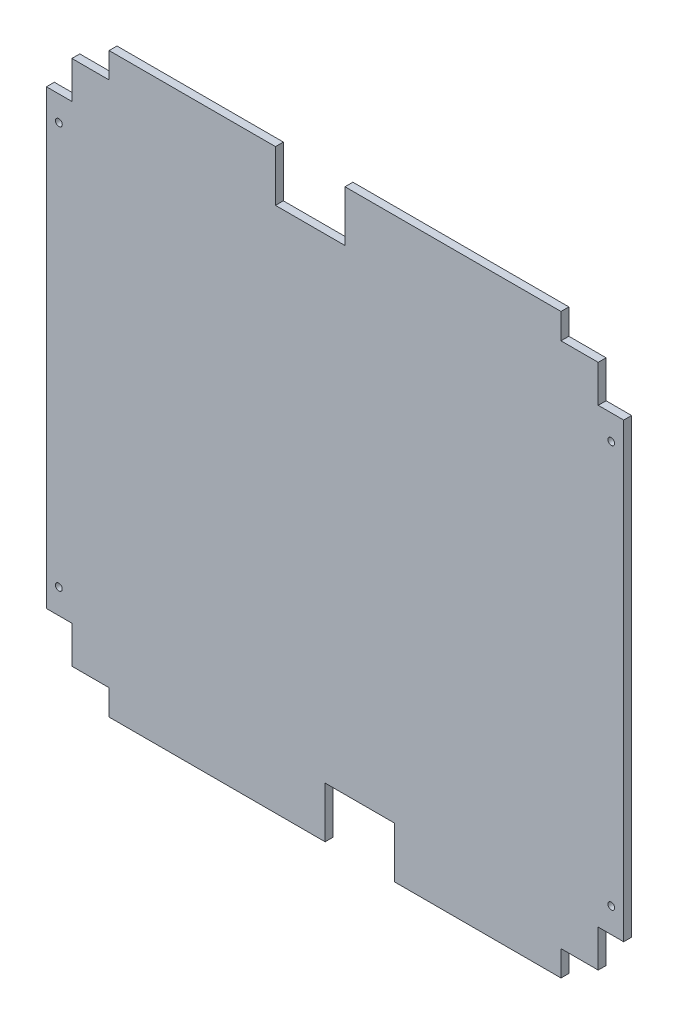
ISO-10303-21;
HEADER;
FILE_DESCRIPTION(('STEP AP214'),'2;1');
FILE_NAME('part.step','',(''),(''),'','','');
FILE_SCHEMA(('AUTOMOTIVE_DESIGN { 1 0 10303 214 1 1 1 1 }'));
ENDSEC;
DATA;
#1=APPLICATION_CONTEXT('core data for automotive mechanical design processes');
#2=APPLICATION_PROTOCOL_DEFINITION('international standard','automotive_design',2000,#1);
#3=PRODUCT_CONTEXT('',#1,'mechanical');
#4=PRODUCT('Part','Part','',(#3));
#5=PRODUCT_RELATED_PRODUCT_CATEGORY('part','',(#4));
#6=PRODUCT_DEFINITION_FORMATION('','',#4);
#7=PRODUCT_DEFINITION_CONTEXT('part definition',#1,'design');
#8=PRODUCT_DEFINITION('design','',#6,#7);
#9=PRODUCT_DEFINITION_SHAPE('','',#8);
#10=(LENGTH_UNIT() NAMED_UNIT(*) SI_UNIT(.MILLI.,.METRE.));
#11=(NAMED_UNIT(*) PLANE_ANGLE_UNIT() SI_UNIT($,.RADIAN.));
#12=(NAMED_UNIT(*) SI_UNIT($,.STERADIAN.) SOLID_ANGLE_UNIT());
#13=UNCERTAINTY_MEASURE_WITH_UNIT(LENGTH_MEASURE(1.E-05),#10,'distance_accuracy_value','');
#14=(GEOMETRIC_REPRESENTATION_CONTEXT(3) GLOBAL_UNCERTAINTY_ASSIGNED_CONTEXT((#13)) GLOBAL_UNIT_ASSIGNED_CONTEXT((#10,
#11,#12)) REPRESENTATION_CONTEXT('',''));
#15=CARTESIAN_POINT('',(0.,0.,0.));
#16=DIRECTION('',(0.,0.,1.));
#17=DIRECTION('',(1.,0.,0.));
#18=AXIS2_PLACEMENT_3D('',#15,#16,#17);
#19=CARTESIAN_POINT('',(0.,0.,6.35));
#20=DIRECTION('',(0.,0.,1.));
#21=DIRECTION('',(1.,0.,0.));
#22=AXIS2_PLACEMENT_3D('',#19,#20,#21);
#23=PLANE('',#22);
#24=CARTESIAN_POINT('',(222.499999999999,162.000000000001,6.35));
#25=DIRECTION('',(0.,0.,1.));
#26=DIRECTION('',(1.,0.,0.));
#27=AXIS2_PLACEMENT_3D('',#24,#25,#26);
#28=CIRCLE('',#27,2.75000000000001);
#29=CARTESIAN_POINT('',(225.249999999999,162.000000000001,6.35));
#30=VERTEX_POINT('',#29);
#31=EDGE_CURVE('E797',#30,#30,#28,.T.);
#32=ORIENTED_EDGE('',*,*,#31,.F.);
#33=EDGE_LOOP('',(#32));
#34=FACE_BOUND('',#33,.T.);
#35=CARTESIAN_POINT('',(-222.5,-162.,6.35));
#36=DIRECTION('',(0.,0.,1.));
#37=DIRECTION('',(1.,0.,0.));
#38=AXIS2_PLACEMENT_3D('',#35,#36,#37);
#39=CIRCLE('',#38,2.75000000000001);
#40=CARTESIAN_POINT('',(-219.75,-162.,6.35));
#41=VERTEX_POINT('',#40);
#42=EDGE_CURVE('E252',#41,#41,#39,.T.);
#43=ORIENTED_EDGE('',*,*,#42,.F.);
#44=EDGE_LOOP('',(#43));
#45=FACE_BOUND('',#44,.T.);
#46=DIRECTION('',(0.,-1.,0.));
#47=VECTOR('',#46,1.);
#48=CARTESIAN_POINT('',(-232.499999999999,182.000000000002,6.35));
#49=LINE('',#48,#47);
#50=CARTESIAN_POINT('',(-232.499999999999,182.000000000002,6.35));
#51=VERTEX_POINT('',#50);
#52=CARTESIAN_POINT('',(-232.5,-182.,6.35));
#53=VERTEX_POINT('',#52);
#54=EDGE_CURVE('E152',#51,#53,#49,.T.);
#55=ORIENTED_EDGE('',*,*,#54,.T.);
#56=DIRECTION('',(1.,0.,0.));
#57=VECTOR('',#56,1.);
#58=CARTESIAN_POINT('',(-232.5,-182.,6.35));
#59=LINE('',#58,#57);
#60=CARTESIAN_POINT('',(-212.,-182.,6.35));
#61=VERTEX_POINT('',#60);
#62=EDGE_CURVE('E454',#53,#61,#59,.T.);
#63=ORIENTED_EDGE('',*,*,#62,.T.);
#64=DIRECTION('',(0.,-1.,0.));
#65=VECTOR('',#64,1.);
#66=CARTESIAN_POINT('',(-212.,-212.,6.35));
#67=LINE('',#66,#65);
#68=CARTESIAN_POINT('',(-212.,-212.,6.35));
#69=VERTEX_POINT('',#68);
#70=EDGE_CURVE('E381',#61,#69,#67,.T.);
#71=ORIENTED_EDGE('',*,*,#70,.T.);
#72=DIRECTION('',(1.,0.,0.));
#73=VECTOR('',#72,1.);
#74=CARTESIAN_POINT('',(-182.,-212.,6.35));
#75=LINE('',#74,#73);
#76=CARTESIAN_POINT('',(-182.,-212.,6.35));
#77=VERTEX_POINT('',#76);
#78=EDGE_CURVE('E400',#69,#77,#75,.T.);
#79=ORIENTED_EDGE('',*,*,#78,.T.);
#80=DIRECTION('',(0.,-1.,0.));
#81=VECTOR('',#80,1.);
#82=CARTESIAN_POINT('',(-182.,-232.5,6.35));
#83=LINE('',#82,#81);
#84=CARTESIAN_POINT('',(-182.,-232.5,6.35));
#85=VERTEX_POINT('',#84);
#86=EDGE_CURVE('E397',#77,#85,#83,.T.);
#87=ORIENTED_EDGE('',*,*,#86,.T.);
#88=DIRECTION('',(1.,0.,0.));
#89=VECTOR('',#88,1.);
#90=CARTESIAN_POINT('',(-182.,-232.5,6.35));
#91=LINE('',#90,#89);
#92=CARTESIAN_POINT('',(-7.99999999999999,-232.5,6.35));
#93=VERTEX_POINT('',#92);
#94=EDGE_CURVE('E399',#85,#93,#91,.T.);
#95=ORIENTED_EDGE('',*,*,#94,.T.);
#96=DIRECTION('',(0.,1.,0.));
#97=VECTOR('',#96,1.);
#98=CARTESIAN_POINT('',(-7.99999999999999,-232.5,6.35));
#99=LINE('',#98,#97);
#100=CARTESIAN_POINT('',(-7.99999999999999,-191.5,6.35));
#101=VERTEX_POINT('',#100);
#102=EDGE_CURVE('E402',#93,#101,#99,.T.);
#103=ORIENTED_EDGE('',*,*,#102,.T.);
#104=DIRECTION('',(1.,0.,0.));
#105=VECTOR('',#104,1.);
#106=CARTESIAN_POINT('',(48.,-191.5,6.35));
#107=LINE('',#106,#105);
#108=CARTESIAN_POINT('',(48.,-191.5,6.35));
#109=VERTEX_POINT('',#108);
#110=EDGE_CURVE('E408',#101,#109,#107,.T.);
#111=ORIENTED_EDGE('',*,*,#110,.T.);
#112=DIRECTION('',(0.,-1.,0.));
#113=VECTOR('',#112,1.);
#114=CARTESIAN_POINT('',(48.,-232.5,6.35));
#115=LINE('',#114,#113);
#116=CARTESIAN_POINT('',(48.,-232.5,6.35));
#117=VERTEX_POINT('',#116);
#118=EDGE_CURVE('E410',#109,#117,#115,.T.);
#119=ORIENTED_EDGE('',*,*,#118,.T.);
#120=DIRECTION('',(1.,0.,0.));
#121=VECTOR('',#120,1.);
#122=CARTESIAN_POINT('',(48.,-232.5,6.35));
#123=LINE('',#122,#121);
#124=CARTESIAN_POINT('',(182.,-232.5,6.35));
#125=VERTEX_POINT('',#124);
#126=EDGE_CURVE('E412',#117,#125,#123,.T.);
#127=ORIENTED_EDGE('',*,*,#126,.T.);
#128=DIRECTION('',(0.,1.,0.));
#129=VECTOR('',#128,1.);
#130=CARTESIAN_POINT('',(182.,-232.5,6.35));
#131=LINE('',#130,#129);
#132=CARTESIAN_POINT('',(182.,-212.,6.35));
#133=VERTEX_POINT('',#132);
#134=EDGE_CURVE('E414',#125,#133,#131,.T.);
#135=ORIENTED_EDGE('',*,*,#134,.T.);
#136=DIRECTION('',(1.,0.,0.));
#137=VECTOR('',#136,1.);
#138=CARTESIAN_POINT('',(182.,-212.,6.35));
#139=LINE('',#138,#137);
#140=CARTESIAN_POINT('',(212.,-212.,6.35));
#141=VERTEX_POINT('',#140);
#142=EDGE_CURVE('E416',#133,#141,#139,.T.);
#143=ORIENTED_EDGE('',*,*,#142,.T.);
#144=DIRECTION('',(0.,1.,0.));
#145=VECTOR('',#144,1.);
#146=CARTESIAN_POINT('',(212.,-212.,6.35));
#147=LINE('',#146,#145);
#148=CARTESIAN_POINT('',(212.,-182.,6.35));
#149=VERTEX_POINT('',#148);
#150=EDGE_CURVE('E418',#141,#149,#147,.T.);
#151=ORIENTED_EDGE('',*,*,#150,.T.);
#152=DIRECTION('',(1.,0.,0.));
#153=VECTOR('',#152,1.);
#154=CARTESIAN_POINT('',(232.5,-182.,6.35));
#155=LINE('',#154,#153);
#156=CARTESIAN_POINT('',(232.5,-182.,6.35));
#157=VERTEX_POINT('',#156);
#158=EDGE_CURVE('E420',#149,#157,#155,.T.);
#159=ORIENTED_EDGE('',*,*,#158,.T.);
#160=DIRECTION('',(0.,1.,0.));
#161=VECTOR('',#160,1.);
#162=CARTESIAN_POINT('',(232.5,-182.,6.35));
#163=LINE('',#162,#161);
#164=CARTESIAN_POINT('',(232.500000000001,181.999999999998,6.35));
#165=VERTEX_POINT('',#164);
#166=EDGE_CURVE('E422',#157,#165,#163,.T.);
#167=ORIENTED_EDGE('',*,*,#166,.T.);
#168=DIRECTION('',(-1.,0.,0.));
#169=VECTOR('',#168,1.);
#170=CARTESIAN_POINT('',(232.500000000001,181.999999999998,6.35));
#171=LINE('',#170,#169);
#172=CARTESIAN_POINT('',(212.000000000001,181.999999999999,6.35));
#173=VERTEX_POINT('',#172);
#174=EDGE_CURVE('E424',#165,#173,#171,.T.);
#175=ORIENTED_EDGE('',*,*,#174,.T.);
#176=DIRECTION('',(0.,1.,0.));
#177=VECTOR('',#176,1.);
#178=CARTESIAN_POINT('',(212.000000000002,211.999999999999,6.35));
#179=LINE('',#178,#177);
#180=CARTESIAN_POINT('',(212.000000000002,211.999999999999,6.35));
#181=VERTEX_POINT('',#180);
#182=EDGE_CURVE('E426',#173,#181,#179,.T.);
#183=ORIENTED_EDGE('',*,*,#182,.T.);
#184=DIRECTION('',(-1.,0.,0.));
#185=VECTOR('',#184,1.);
#186=CARTESIAN_POINT('',(182.000000000002,211.999999999999,6.35));
#187=LINE('',#186,#185);
#188=CARTESIAN_POINT('',(182.000000000002,211.999999999999,6.35));
#189=VERTEX_POINT('',#188);
#190=EDGE_CURVE('E428',#181,#189,#187,.T.);
#191=ORIENTED_EDGE('',*,*,#190,.T.);
#192=DIRECTION('',(0.,1.,0.));
#193=VECTOR('',#192,1.);
#194=CARTESIAN_POINT('',(182.000000000002,232.499999999999,6.35));
#195=LINE('',#194,#193);
#196=CARTESIAN_POINT('',(182.000000000002,232.499999999999,6.35));
#197=VERTEX_POINT('',#196);
#198=EDGE_CURVE('E430',#189,#197,#195,.T.);
#199=ORIENTED_EDGE('',*,*,#198,.T.);
#200=DIRECTION('',(-1.,0.,0.));
#201=VECTOR('',#200,1.);
#202=CARTESIAN_POINT('',(182.000000000002,232.499999999999,6.35));
#203=LINE('',#202,#201);
#204=CARTESIAN_POINT('',(8.00000000000036,232.5,6.35));
#205=VERTEX_POINT('',#204);
#206=EDGE_CURVE('E432',#197,#205,#203,.T.);
#207=ORIENTED_EDGE('',*,*,#206,.T.);
#208=DIRECTION('',(0.,-1.,0.));
#209=VECTOR('',#208,1.);
#210=CARTESIAN_POINT('',(8.00000000000036,232.5,6.35));
#211=LINE('',#210,#209);
#212=CARTESIAN_POINT('',(8.00000000000036,191.5,6.35));
#213=VERTEX_POINT('',#212);
#214=EDGE_CURVE('E434',#205,#213,#211,.T.);
#215=ORIENTED_EDGE('',*,*,#214,.T.);
#216=DIRECTION('',(-1.,0.,0.));
#217=VECTOR('',#216,1.);
#218=CARTESIAN_POINT('',(-47.9999999999996,191.5,6.35));
#219=LINE('',#218,#217);
#220=CARTESIAN_POINT('',(-47.9999999999996,191.5,6.35));
#221=VERTEX_POINT('',#220);
#222=EDGE_CURVE('E436',#213,#221,#219,.T.);
#223=ORIENTED_EDGE('',*,*,#222,.T.);
#224=DIRECTION('',(0.,1.,0.));
#225=VECTOR('',#224,1.);
#226=CARTESIAN_POINT('',(-47.9999999999997,232.5,6.35));
#227=LINE('',#226,#225);
#228=CARTESIAN_POINT('',(-47.9999999999997,232.5,6.35));
#229=VERTEX_POINT('',#228);
#230=EDGE_CURVE('E438',#221,#229,#227,.T.);
#231=ORIENTED_EDGE('',*,*,#230,.T.);
#232=DIRECTION('',(-1.,0.,0.));
#233=VECTOR('',#232,1.);
#234=CARTESIAN_POINT('',(-47.9999999999997,232.5,6.35));
#235=LINE('',#234,#233);
#236=CARTESIAN_POINT('',(-181.999999999998,232.500000000001,6.35));
#237=VERTEX_POINT('',#236);
#238=EDGE_CURVE('E440',#229,#237,#235,.T.);
#239=ORIENTED_EDGE('',*,*,#238,.T.);
#240=DIRECTION('',(0.,-1.,0.));
#241=VECTOR('',#240,1.);
#242=CARTESIAN_POINT('',(-181.999999999998,232.500000000001,6.35));
#243=LINE('',#242,#241);
#244=CARTESIAN_POINT('',(-181.999999999999,212.000000000001,6.35));
#245=VERTEX_POINT('',#244);
#246=EDGE_CURVE('E232',#237,#245,#243,.T.);
#247=ORIENTED_EDGE('',*,*,#246,.T.);
#248=DIRECTION('',(-1.,0.,0.));
#249=VECTOR('',#248,1.);
#250=CARTESIAN_POINT('',(-181.999999999999,212.000000000001,6.35));
#251=LINE('',#250,#249);
#252=CARTESIAN_POINT('',(-211.999999999999,212.000000000002,6.35));
#253=VERTEX_POINT('',#252);
#254=EDGE_CURVE('E226',#245,#253,#251,.T.);
#255=ORIENTED_EDGE('',*,*,#254,.T.);
#256=DIRECTION('',(0.,-1.,0.));
#257=VECTOR('',#256,1.);
#258=CARTESIAN_POINT('',(-211.999999999999,212.000000000002,6.35));
#259=LINE('',#258,#257);
#260=CARTESIAN_POINT('',(-211.999999999999,182.000000000002,6.35));
#261=VERTEX_POINT('',#260);
#262=EDGE_CURVE('E230',#253,#261,#259,.T.);
#263=ORIENTED_EDGE('',*,*,#262,.T.);
#264=DIRECTION('',(-1.,0.,0.));
#265=VECTOR('',#264,1.);
#266=CARTESIAN_POINT('',(-232.499999999999,182.000000000002,6.35));
#267=LINE('',#266,#265);
#268=EDGE_CURVE('E50',#261,#51,#267,.T.);
#269=ORIENTED_EDGE('',*,*,#268,.T.);
#270=EDGE_LOOP('',(#55,#63,#71,#79,#87,#95,#103,#111,#119,#127,#135,#143,#151,#159,#167,#175,
#183,#191,#199,#207,#215,#223,#231,#239,#247,#255,#263,#269));
#271=FACE_BOUND('',#270,.T.);
#272=CARTESIAN_POINT('',(222.5,-162.,6.35));
#273=DIRECTION('',(0.,0.,1.));
#274=DIRECTION('',(-1.,0.,0.));
#275=AXIS2_PLACEMENT_3D('',#272,#273,#274);
#276=CIRCLE('',#275,2.75000000000001);
#277=CARTESIAN_POINT('',(219.75,-162.,6.35));
#278=VERTEX_POINT('',#277);
#279=EDGE_CURVE('E803',#278,#278,#276,.T.);
#280=ORIENTED_EDGE('',*,*,#279,.F.);
#281=EDGE_LOOP('',(#280));
#282=FACE_BOUND('',#281,.T.);
#283=CARTESIAN_POINT('',(-222.5,161.999999999999,6.35));
#284=DIRECTION('',(0.,0.,1.));
#285=DIRECTION('',(-1.,0.,0.));
#286=AXIS2_PLACEMENT_3D('',#283,#284,#285);
#287=CIRCLE('',#286,2.75000000000001);
#288=CARTESIAN_POINT('',(-225.25,161.999999999999,6.35));
#289=VERTEX_POINT('',#288);
#290=EDGE_CURVE('E788',#289,#289,#287,.T.);
#291=ORIENTED_EDGE('',*,*,#290,.F.);
#292=EDGE_LOOP('',(#291));
#293=FACE_BOUND('',#292,.T.);
#294=ADVANCED_FACE('F33',(#34,#45,#271,#282,#293),#23,.T.);
#295=CARTESIAN_POINT('',(0.,0.,0.));
#296=DIRECTION('',(0.,0.,1.));
#297=DIRECTION('',(1.,0.,0.));
#298=AXIS2_PLACEMENT_3D('',#295,#296,#297);
#299=PLANE('',#298);
#300=CARTESIAN_POINT('',(222.499999999999,162.000000000001,0.));
#301=DIRECTION('',(0.,0.,1.));
#302=DIRECTION('',(1.,0.,0.));
#303=AXIS2_PLACEMENT_3D('',#300,#301,#302);
#304=CIRCLE('',#303,2.75000000000001);
#305=CARTESIAN_POINT('',(225.249999999999,162.000000000001,0.));
#306=VERTEX_POINT('',#305);
#307=EDGE_CURVE('E794',#306,#306,#304,.T.);
#308=ORIENTED_EDGE('',*,*,#307,.T.);
#309=EDGE_LOOP('',(#308));
#310=FACE_BOUND('',#309,.T.);
#311=CARTESIAN_POINT('',(-222.5,-162.,0.));
#312=DIRECTION('',(0.,0.,1.));
#313=DIRECTION('',(1.,0.,0.));
#314=AXIS2_PLACEMENT_3D('',#311,#312,#313);
#315=CIRCLE('',#314,2.75000000000001);
#316=CARTESIAN_POINT('',(-219.75,-162.,0.));
#317=VERTEX_POINT('',#316);
#318=EDGE_CURVE('E458',#317,#317,#315,.T.);
#319=ORIENTED_EDGE('',*,*,#318,.T.);
#320=EDGE_LOOP('',(#319));
#321=FACE_BOUND('',#320,.T.);
#322=DIRECTION('',(0.,-1.,0.));
#323=VECTOR('',#322,1.);
#324=CARTESIAN_POINT('',(-232.5,-182.,0.));
#325=LINE('',#324,#323);
#326=CARTESIAN_POINT('',(-232.499999999999,182.000000000002,0.));
#327=VERTEX_POINT('',#326);
#328=CARTESIAN_POINT('',(-232.5,-182.,0.));
#329=VERTEX_POINT('',#328);
#330=EDGE_CURVE('E146',#327,#329,#325,.T.);
#331=ORIENTED_EDGE('',*,*,#330,.F.);
#332=DIRECTION('',(-1.,0.,0.));
#333=VECTOR('',#332,1.);
#334=CARTESIAN_POINT('',(-232.499999999999,182.000000000002,0.));
#335=LINE('',#334,#333);
#336=CARTESIAN_POINT('',(-211.999999999999,182.000000000002,0.));
#337=VERTEX_POINT('',#336);
#338=EDGE_CURVE('E303',#337,#327,#335,.T.);
#339=ORIENTED_EDGE('',*,*,#338,.F.);
#340=DIRECTION('',(0.,-1.,0.));
#341=VECTOR('',#340,1.);
#342=CARTESIAN_POINT('',(-211.999999999999,212.000000000002,0.));
#343=LINE('',#342,#341);
#344=CARTESIAN_POINT('',(-211.999999999999,212.000000000002,0.));
#345=VERTEX_POINT('',#344);
#346=EDGE_CURVE('E139',#345,#337,#343,.T.);
#347=ORIENTED_EDGE('',*,*,#346,.F.);
#348=DIRECTION('',(-1.,0.,0.));
#349=VECTOR('',#348,1.);
#350=CARTESIAN_POINT('',(-181.999999999999,212.000000000001,0.));
#351=LINE('',#350,#349);
#352=CARTESIAN_POINT('',(-181.999999999999,212.000000000001,0.));
#353=VERTEX_POINT('',#352);
#354=EDGE_CURVE('E240',#353,#345,#351,.T.);
#355=ORIENTED_EDGE('',*,*,#354,.F.);
#356=DIRECTION('',(0.,-1.,0.));
#357=VECTOR('',#356,1.);
#358=CARTESIAN_POINT('',(-181.999999999998,232.500000000001,0.));
#359=LINE('',#358,#357);
#360=CARTESIAN_POINT('',(-181.999999999998,232.500000000001,0.));
#361=VERTEX_POINT('',#360);
#362=EDGE_CURVE('E299',#361,#353,#359,.T.);
#363=ORIENTED_EDGE('',*,*,#362,.F.);
#364=DIRECTION('',(-1.,0.,0.));
#365=VECTOR('',#364,1.);
#366=CARTESIAN_POINT('',(-47.9999999999997,232.5,0.));
#367=LINE('',#366,#365);
#368=CARTESIAN_POINT('',(-47.9999999999997,232.5,0.));
#369=VERTEX_POINT('',#368);
#370=EDGE_CURVE('E297',#369,#361,#367,.T.);
#371=ORIENTED_EDGE('',*,*,#370,.F.);
#372=DIRECTION('',(0.,1.,0.));
#373=VECTOR('',#372,1.);
#374=CARTESIAN_POINT('',(-47.9999999999997,232.5,0.));
#375=LINE('',#374,#373);
#376=CARTESIAN_POINT('',(-47.9999999999996,191.5,0.));
#377=VERTEX_POINT('',#376);
#378=EDGE_CURVE('E295',#377,#369,#375,.T.);
#379=ORIENTED_EDGE('',*,*,#378,.F.);
#380=DIRECTION('',(-1.,0.,0.));
#381=VECTOR('',#380,1.);
#382=CARTESIAN_POINT('',(-47.9999999999996,191.5,0.));
#383=LINE('',#382,#381);
#384=CARTESIAN_POINT('',(8.00000000000036,191.5,0.));
#385=VERTEX_POINT('',#384);
#386=EDGE_CURVE('E293',#385,#377,#383,.T.);
#387=ORIENTED_EDGE('',*,*,#386,.F.);
#388=DIRECTION('',(0.,-1.,0.));
#389=VECTOR('',#388,1.);
#390=CARTESIAN_POINT('',(8.00000000000036,232.5,0.));
#391=LINE('',#390,#389);
#392=CARTESIAN_POINT('',(8.00000000000036,232.5,0.));
#393=VERTEX_POINT('',#392);
#394=EDGE_CURVE('E291',#393,#385,#391,.T.);
#395=ORIENTED_EDGE('',*,*,#394,.F.);
#396=DIRECTION('',(-1.,0.,0.));
#397=VECTOR('',#396,1.);
#398=CARTESIAN_POINT('',(182.000000000002,232.499999999999,0.));
#399=LINE('',#398,#397);
#400=CARTESIAN_POINT('',(182.000000000002,232.499999999999,0.));
#401=VERTEX_POINT('',#400);
#402=EDGE_CURVE('E289',#401,#393,#399,.T.);
#403=ORIENTED_EDGE('',*,*,#402,.F.);
#404=DIRECTION('',(0.,1.,0.));
#405=VECTOR('',#404,1.);
#406=CARTESIAN_POINT('',(182.000000000002,232.499999999999,0.));
#407=LINE('',#406,#405);
#408=CARTESIAN_POINT('',(182.000000000002,211.999999999999,0.));
#409=VERTEX_POINT('',#408);
#410=EDGE_CURVE('E287',#409,#401,#407,.T.);
#411=ORIENTED_EDGE('',*,*,#410,.F.);
#412=DIRECTION('',(-1.,0.,0.));
#413=VECTOR('',#412,1.);
#414=CARTESIAN_POINT('',(182.000000000002,211.999999999999,0.));
#415=LINE('',#414,#413);
#416=CARTESIAN_POINT('',(212.000000000002,211.999999999999,0.));
#417=VERTEX_POINT('',#416);
#418=EDGE_CURVE('E285',#417,#409,#415,.T.);
#419=ORIENTED_EDGE('',*,*,#418,.F.);
#420=DIRECTION('',(0.,1.,0.));
#421=VECTOR('',#420,1.);
#422=CARTESIAN_POINT('',(212.000000000002,211.999999999999,0.));
#423=LINE('',#422,#421);
#424=CARTESIAN_POINT('',(212.000000000001,181.999999999999,0.));
#425=VERTEX_POINT('',#424);
#426=EDGE_CURVE('E283',#425,#417,#423,.T.);
#427=ORIENTED_EDGE('',*,*,#426,.F.);
#428=DIRECTION('',(-1.,0.,0.));
#429=VECTOR('',#428,1.);
#430=CARTESIAN_POINT('',(232.500000000001,181.999999999998,0.));
#431=LINE('',#430,#429);
#432=CARTESIAN_POINT('',(232.500000000001,181.999999999998,0.));
#433=VERTEX_POINT('',#432);
#434=EDGE_CURVE('E281',#433,#425,#431,.T.);
#435=ORIENTED_EDGE('',*,*,#434,.F.);
#436=DIRECTION('',(0.,1.,0.));
#437=VECTOR('',#436,1.);
#438=CARTESIAN_POINT('',(232.500000000001,181.999999999998,0.));
#439=LINE('',#438,#437);
#440=CARTESIAN_POINT('',(232.5,-182.,0.));
#441=VERTEX_POINT('',#440);
#442=EDGE_CURVE('E279',#441,#433,#439,.T.);
#443=ORIENTED_EDGE('',*,*,#442,.F.);
#444=DIRECTION('',(1.,0.,0.));
#445=VECTOR('',#444,1.);
#446=CARTESIAN_POINT('',(232.5,-182.,0.));
#447=LINE('',#446,#445);
#448=CARTESIAN_POINT('',(212.,-182.,0.));
#449=VERTEX_POINT('',#448);
#450=EDGE_CURVE('E276',#449,#441,#447,.T.);
#451=ORIENTED_EDGE('',*,*,#450,.F.);
#452=DIRECTION('',(0.,1.,0.));
#453=VECTOR('',#452,1.);
#454=CARTESIAN_POINT('',(212.,-212.,0.));
#455=LINE('',#454,#453);
#456=CARTESIAN_POINT('',(212.,-212.,0.));
#457=VERTEX_POINT('',#456);
#458=EDGE_CURVE('E274',#457,#449,#455,.T.);
#459=ORIENTED_EDGE('',*,*,#458,.F.);
#460=DIRECTION('',(1.,0.,0.));
#461=VECTOR('',#460,1.);
#462=CARTESIAN_POINT('',(182.,-212.,0.));
#463=LINE('',#462,#461);
#464=CARTESIAN_POINT('',(182.,-212.,0.));
#465=VERTEX_POINT('',#464);
#466=EDGE_CURVE('E272',#465,#457,#463,.T.);
#467=ORIENTED_EDGE('',*,*,#466,.F.);
#468=DIRECTION('',(0.,1.,0.));
#469=VECTOR('',#468,1.);
#470=CARTESIAN_POINT('',(182.,-232.5,0.));
#471=LINE('',#470,#469);
#472=CARTESIAN_POINT('',(182.,-232.5,0.));
#473=VERTEX_POINT('',#472);
#474=EDGE_CURVE('E270',#473,#465,#471,.T.);
#475=ORIENTED_EDGE('',*,*,#474,.F.);
#476=DIRECTION('',(1.,0.,0.));
#477=VECTOR('',#476,1.);
#478=CARTESIAN_POINT('',(48.,-232.5,0.));
#479=LINE('',#478,#477);
#480=CARTESIAN_POINT('',(48.,-232.5,0.));
#481=VERTEX_POINT('',#480);
#482=EDGE_CURVE('E268',#481,#473,#479,.T.);
#483=ORIENTED_EDGE('',*,*,#482,.F.);
#484=DIRECTION('',(0.,-1.,0.));
#485=VECTOR('',#484,1.);
#486=CARTESIAN_POINT('',(48.,-232.5,0.));
#487=LINE('',#486,#485);
#488=CARTESIAN_POINT('',(48.,-191.5,0.));
#489=VERTEX_POINT('',#488);
#490=EDGE_CURVE('E266',#489,#481,#487,.T.);
#491=ORIENTED_EDGE('',*,*,#490,.F.);
#492=DIRECTION('',(1.,0.,0.));
#493=VECTOR('',#492,1.);
#494=CARTESIAN_POINT('',(48.,-191.5,0.));
#495=LINE('',#494,#493);
#496=CARTESIAN_POINT('',(-7.99999999999999,-191.5,0.));
#497=VERTEX_POINT('',#496);
#498=EDGE_CURVE('E264',#497,#489,#495,.T.);
#499=ORIENTED_EDGE('',*,*,#498,.F.);
#500=DIRECTION('',(0.,1.,0.));
#501=VECTOR('',#500,1.);
#502=CARTESIAN_POINT('',(-7.99999999999999,-232.5,0.));
#503=LINE('',#502,#501);
#504=CARTESIAN_POINT('',(-7.99999999999999,-232.5,0.));
#505=VERTEX_POINT('',#504);
#506=EDGE_CURVE('E262',#505,#497,#503,.T.);
#507=ORIENTED_EDGE('',*,*,#506,.F.);
#508=DIRECTION('',(1.,0.,0.));
#509=VECTOR('',#508,1.);
#510=CARTESIAN_POINT('',(-182.,-232.5,0.));
#511=LINE('',#510,#509);
#512=CARTESIAN_POINT('',(-182.,-232.5,0.));
#513=VERTEX_POINT('',#512);
#514=EDGE_CURVE('E260',#513,#505,#511,.T.);
#515=ORIENTED_EDGE('',*,*,#514,.F.);
#516=DIRECTION('',(0.,-1.,0.));
#517=VECTOR('',#516,1.);
#518=CARTESIAN_POINT('',(-182.,-232.5,0.));
#519=LINE('',#518,#517);
#520=CARTESIAN_POINT('',(-182.,-212.,0.));
#521=VERTEX_POINT('',#520);
#522=EDGE_CURVE('E258',#521,#513,#519,.T.);
#523=ORIENTED_EDGE('',*,*,#522,.F.);
#524=DIRECTION('',(1.,0.,0.));
#525=VECTOR('',#524,1.);
#526=CARTESIAN_POINT('',(-182.,-212.,0.));
#527=LINE('',#526,#525);
#528=CARTESIAN_POINT('',(-212.,-212.,0.));
#529=VERTEX_POINT('',#528);
#530=EDGE_CURVE('E256',#529,#521,#527,.T.);
#531=ORIENTED_EDGE('',*,*,#530,.F.);
#532=DIRECTION('',(0.,-1.,0.));
#533=VECTOR('',#532,1.);
#534=CARTESIAN_POINT('',(-212.,-212.,0.));
#535=LINE('',#534,#533);
#536=CARTESIAN_POINT('',(-212.,-182.,0.));
#537=VERTEX_POINT('',#536);
#538=EDGE_CURVE('E254',#537,#529,#535,.T.);
#539=ORIENTED_EDGE('',*,*,#538,.F.);
#540=DIRECTION('',(1.,0.,0.));
#541=VECTOR('',#540,1.);
#542=CARTESIAN_POINT('',(-232.5,-182.,0.));
#543=LINE('',#542,#541);
#544=EDGE_CURVE('E251',#329,#537,#543,.T.);
#545=ORIENTED_EDGE('',*,*,#544,.F.);
#546=EDGE_LOOP('',(#331,#339,#347,#355,#363,#371,#379,#387,#395,#403,#411,#419,#427,#435,#443,
#451,#459,#467,#475,#483,#491,#499,#507,#515,#523,#531,#539,#545));
#547=FACE_BOUND('',#546,.T.);
#548=CARTESIAN_POINT('',(222.5,-162.,0.));
#549=DIRECTION('',(0.,0.,1.));
#550=DIRECTION('',(-1.,0.,0.));
#551=AXIS2_PLACEMENT_3D('',#548,#549,#550);
#552=CIRCLE('',#551,2.75000000000001);
#553=CARTESIAN_POINT('',(219.75,-162.,0.));
#554=VERTEX_POINT('',#553);
#555=EDGE_CURVE('E800',#554,#554,#552,.T.);
#556=ORIENTED_EDGE('',*,*,#555,.T.);
#557=EDGE_LOOP('',(#556));
#558=FACE_BOUND('',#557,.T.);
#559=CARTESIAN_POINT('',(-222.5,161.999999999999,0.));
#560=DIRECTION('',(0.,0.,1.));
#561=DIRECTION('',(-1.,0.,0.));
#562=AXIS2_PLACEMENT_3D('',#559,#560,#561);
#563=CIRCLE('',#562,2.75000000000001);
#564=CARTESIAN_POINT('',(-225.25,161.999999999999,0.));
#565=VERTEX_POINT('',#564);
#566=EDGE_CURVE('E791',#565,#565,#563,.T.);
#567=ORIENTED_EDGE('',*,*,#566,.T.);
#568=EDGE_LOOP('',(#567));
#569=FACE_BOUND('',#568,.T.);
#570=ADVANCED_FACE('F385',(#310,#321,#547,#558,#569),#299,.F.);
#571=CARTESIAN_POINT('',(-232.5,-182.,6.35));
#572=DIRECTION('',(1.,0.,0.));
#573=DIRECTION('',(0.,0.,-1.));
#574=AXIS2_PLACEMENT_3D('',#571,#572,#573);
#575=PLANE('',#574);
#576=ORIENTED_EDGE('',*,*,#330,.T.);
#577=DIRECTION('',(0.,0.,-1.));
#578=VECTOR('',#577,1.);
#579=CARTESIAN_POINT('',(-232.5,-182.,6.35));
#580=LINE('',#579,#578);
#581=EDGE_CURVE('E11',#53,#329,#580,.T.);
#582=ORIENTED_EDGE('',*,*,#581,.F.);
#583=ORIENTED_EDGE('',*,*,#54,.F.);
#584=DIRECTION('',(0.,0.,-1.));
#585=VECTOR('',#584,1.);
#586=CARTESIAN_POINT('',(-232.499999999999,182.000000000002,6.35));
#587=LINE('',#586,#585);
#588=EDGE_CURVE('E246',#51,#327,#587,.T.);
#589=ORIENTED_EDGE('',*,*,#588,.T.);
#590=EDGE_LOOP('',(#576,#582,#583,#589));
#591=FACE_BOUND('',#590,.T.);
#592=ADVANCED_FACE('F35',(#591),#575,.F.);
#593=CARTESIAN_POINT('',(-232.5,-182.,6.35));
#594=DIRECTION('',(0.,1.,0.));
#595=DIRECTION('',(-1.,0.,0.));
#596=AXIS2_PLACEMENT_3D('',#593,#594,#595);
#597=PLANE('',#596);
#598=ORIENTED_EDGE('',*,*,#544,.T.);
#599=DIRECTION('',(0.,0.,-1.));
#600=VECTOR('',#599,1.);
#601=CARTESIAN_POINT('',(-212.,-182.,6.35));
#602=LINE('',#601,#600);
#603=EDGE_CURVE('E42',#61,#537,#602,.T.);
#604=ORIENTED_EDGE('',*,*,#603,.F.);
#605=ORIENTED_EDGE('',*,*,#62,.F.);
#606=ORIENTED_EDGE('',*,*,#581,.T.);
#607=EDGE_LOOP('',(#598,#604,#605,#606));
#608=FACE_BOUND('',#607,.T.);
#609=ADVANCED_FACE('F460',(#608),#597,.F.);
#610=CARTESIAN_POINT('',(-212.,-212.,6.35));
#611=DIRECTION('',(1.,0.,0.));
#612=DIRECTION('',(0.,0.,-1.));
#613=AXIS2_PLACEMENT_3D('',#610,#611,#612);
#614=PLANE('',#613);
#615=ORIENTED_EDGE('',*,*,#538,.T.);
#616=DIRECTION('',(0.,0.,-1.));
#617=VECTOR('',#616,1.);
#618=CARTESIAN_POINT('',(-212.,-212.,6.35));
#619=LINE('',#618,#617);
#620=EDGE_CURVE('E372',#69,#529,#619,.T.);
#621=ORIENTED_EDGE('',*,*,#620,.F.);
#622=ORIENTED_EDGE('',*,*,#70,.F.);
#623=ORIENTED_EDGE('',*,*,#603,.T.);
#624=EDGE_LOOP('',(#615,#621,#622,#623));
#625=FACE_BOUND('',#624,.T.);
#626=ADVANCED_FACE('F379',(#625),#614,.F.);
#627=CARTESIAN_POINT('',(-182.,-212.,6.35));
#628=DIRECTION('',(0.,1.,0.));
#629=DIRECTION('',(0.,0.,1.));
#630=AXIS2_PLACEMENT_3D('',#627,#628,#629);
#631=PLANE('',#630);
#632=ORIENTED_EDGE('',*,*,#530,.T.);
#633=DIRECTION('',(0.,0.,-1.));
#634=VECTOR('',#633,1.);
#635=CARTESIAN_POINT('',(-182.,-212.,6.35));
#636=LINE('',#635,#634);
#637=EDGE_CURVE('E369',#77,#521,#636,.T.);
#638=ORIENTED_EDGE('',*,*,#637,.F.);
#639=ORIENTED_EDGE('',*,*,#78,.F.);
#640=ORIENTED_EDGE('',*,*,#620,.T.);
#641=EDGE_LOOP('',(#632,#638,#639,#640));
#642=FACE_BOUND('',#641,.T.);
#643=ADVANCED_FACE('F391',(#642),#631,.F.);
#644=CARTESIAN_POINT('',(-182.,-232.5,6.35));
#645=DIRECTION('',(1.,0.,0.));
#646=DIRECTION('',(0.,0.,-1.));
#647=AXIS2_PLACEMENT_3D('',#644,#645,#646);
#648=PLANE('',#647);
#649=ORIENTED_EDGE('',*,*,#522,.T.);
#650=DIRECTION('',(0.,0.,-1.));
#651=VECTOR('',#650,1.);
#652=CARTESIAN_POINT('',(-182.,-232.5,6.35));
#653=LINE('',#652,#651);
#654=EDGE_CURVE('E366',#85,#513,#653,.T.);
#655=ORIENTED_EDGE('',*,*,#654,.F.);
#656=ORIENTED_EDGE('',*,*,#86,.F.);
#657=ORIENTED_EDGE('',*,*,#637,.T.);
#658=EDGE_LOOP('',(#649,#655,#656,#657));
#659=FACE_BOUND('',#658,.T.);
#660=ADVANCED_FACE('F395',(#659),#648,.F.);
#661=CARTESIAN_POINT('',(-182.,-232.5,6.35));
#662=DIRECTION('',(0.,1.,0.));
#663=DIRECTION('',(-1.,0.,0.));
#664=AXIS2_PLACEMENT_3D('',#661,#662,#663);
#665=PLANE('',#664);
#666=ORIENTED_EDGE('',*,*,#514,.T.);
#667=DIRECTION('',(0.,0.,-1.));
#668=VECTOR('',#667,1.);
#669=CARTESIAN_POINT('',(-7.99999999999999,-232.5,6.35));
#670=LINE('',#669,#668);
#671=EDGE_CURVE('E363',#93,#505,#670,.T.);
#672=ORIENTED_EDGE('',*,*,#671,.F.);
#673=ORIENTED_EDGE('',*,*,#94,.F.);
#674=ORIENTED_EDGE('',*,*,#654,.T.);
#675=EDGE_LOOP('',(#666,#672,#673,#674));
#676=FACE_BOUND('',#675,.T.);
#677=ADVANCED_FACE('F558',(#676),#665,.F.);
#678=CARTESIAN_POINT('',(-7.99999999999999,-232.5,6.35));
#679=DIRECTION('',(-1.,0.,0.));
#680=DIRECTION('',(0.,0.,1.));
#681=AXIS2_PLACEMENT_3D('',#678,#679,#680);
#682=PLANE('',#681);
#683=ORIENTED_EDGE('',*,*,#506,.T.);
#684=DIRECTION('',(0.,0.,-1.));
#685=VECTOR('',#684,1.);
#686=CARTESIAN_POINT('',(-7.99999999999999,-191.5,6.35));
#687=LINE('',#686,#685);
#688=EDGE_CURVE('E360',#101,#497,#687,.T.);
#689=ORIENTED_EDGE('',*,*,#688,.F.);
#690=ORIENTED_EDGE('',*,*,#102,.F.);
#691=ORIENTED_EDGE('',*,*,#671,.T.);
#692=EDGE_LOOP('',(#683,#689,#690,#691));
#693=FACE_BOUND('',#692,.T.);
#694=ADVANCED_FACE('F554',(#693),#682,.F.);
#695=CARTESIAN_POINT('',(48.,-191.5,6.35));
#696=DIRECTION('',(0.,1.,0.));
#697=DIRECTION('',(-1.,0.,0.));
#698=AXIS2_PLACEMENT_3D('',#695,#696,#697);
#699=PLANE('',#698);
#700=ORIENTED_EDGE('',*,*,#498,.T.);
#701=DIRECTION('',(0.,0.,-1.));
#702=VECTOR('',#701,1.);
#703=CARTESIAN_POINT('',(48.,-191.5,6.35));
#704=LINE('',#703,#702);
#705=EDGE_CURVE('E357',#109,#489,#704,.T.);
#706=ORIENTED_EDGE('',*,*,#705,.F.);
#707=ORIENTED_EDGE('',*,*,#110,.F.);
#708=ORIENTED_EDGE('',*,*,#688,.T.);
#709=EDGE_LOOP('',(#700,#706,#707,#708));
#710=FACE_BOUND('',#709,.T.);
#711=ADVANCED_FACE('F550',(#710),#699,.F.);
#712=CARTESIAN_POINT('',(48.,-232.5,6.35));
#713=DIRECTION('',(1.,0.,0.));
#714=DIRECTION('',(0.,1.,0.));
#715=AXIS2_PLACEMENT_3D('',#712,#713,#714);
#716=PLANE('',#715);
#717=ORIENTED_EDGE('',*,*,#490,.T.);
#718=DIRECTION('',(0.,0.,-1.));
#719=VECTOR('',#718,1.);
#720=CARTESIAN_POINT('',(48.,-232.5,6.35));
#721=LINE('',#720,#719);
#722=EDGE_CURVE('E354',#117,#481,#721,.T.);
#723=ORIENTED_EDGE('',*,*,#722,.F.);
#724=ORIENTED_EDGE('',*,*,#118,.F.);
#725=ORIENTED_EDGE('',*,*,#705,.T.);
#726=EDGE_LOOP('',(#717,#723,#724,#725));
#727=FACE_BOUND('',#726,.T.);
#728=ADVANCED_FACE('F546',(#727),#716,.F.);
#729=CARTESIAN_POINT('',(48.,-232.5,6.35));
#730=DIRECTION('',(0.,1.,0.));
#731=DIRECTION('',(-1.,0.,0.));
#732=AXIS2_PLACEMENT_3D('',#729,#730,#731);
#733=PLANE('',#732);
#734=ORIENTED_EDGE('',*,*,#482,.T.);
#735=DIRECTION('',(0.,0.,-1.));
#736=VECTOR('',#735,1.);
#737=CARTESIAN_POINT('',(182.,-232.5,6.35));
#738=LINE('',#737,#736);
#739=EDGE_CURVE('E351',#125,#473,#738,.T.);
#740=ORIENTED_EDGE('',*,*,#739,.F.);
#741=ORIENTED_EDGE('',*,*,#126,.F.);
#742=ORIENTED_EDGE('',*,*,#722,.T.);
#743=EDGE_LOOP('',(#734,#740,#741,#742));
#744=FACE_BOUND('',#743,.T.);
#745=ADVANCED_FACE('F542',(#744),#733,.F.);
#746=CARTESIAN_POINT('',(182.,-232.5,6.35));
#747=DIRECTION('',(-1.,0.,0.));
#748=DIRECTION('',(0.,-1.,0.));
#749=AXIS2_PLACEMENT_3D('',#746,#747,#748);
#750=PLANE('',#749);
#751=ORIENTED_EDGE('',*,*,#474,.T.);
#752=DIRECTION('',(0.,0.,-1.));
#753=VECTOR('',#752,1.);
#754=CARTESIAN_POINT('',(182.,-212.,6.35));
#755=LINE('',#754,#753);
#756=EDGE_CURVE('E348',#133,#465,#755,.T.);
#757=ORIENTED_EDGE('',*,*,#756,.F.);
#758=ORIENTED_EDGE('',*,*,#134,.F.);
#759=ORIENTED_EDGE('',*,*,#739,.T.);
#760=EDGE_LOOP('',(#751,#757,#758,#759));
#761=FACE_BOUND('',#760,.T.);
#762=ADVANCED_FACE('F538',(#761),#750,.F.);
#763=CARTESIAN_POINT('',(182.,-212.,6.35));
#764=DIRECTION('',(0.,1.,0.));
#765=DIRECTION('',(0.,0.,1.));
#766=AXIS2_PLACEMENT_3D('',#763,#764,#765);
#767=PLANE('',#766);
#768=ORIENTED_EDGE('',*,*,#466,.T.);
#769=DIRECTION('',(0.,0.,-1.));
#770=VECTOR('',#769,1.);
#771=CARTESIAN_POINT('',(212.,-212.,6.35));
#772=LINE('',#771,#770);
#773=EDGE_CURVE('E345',#141,#457,#772,.T.);
#774=ORIENTED_EDGE('',*,*,#773,.F.);
#775=ORIENTED_EDGE('',*,*,#142,.F.);
#776=ORIENTED_EDGE('',*,*,#756,.T.);
#777=EDGE_LOOP('',(#768,#774,#775,#776));
#778=FACE_BOUND('',#777,.T.);
#779=ADVANCED_FACE('F534',(#778),#767,.F.);
#780=CARTESIAN_POINT('',(212.,-212.,6.35));
#781=DIRECTION('',(-1.,0.,0.));
#782=DIRECTION('',(0.,0.,1.));
#783=AXIS2_PLACEMENT_3D('',#780,#781,#782);
#784=PLANE('',#783);
#785=ORIENTED_EDGE('',*,*,#458,.T.);
#786=DIRECTION('',(0.,0.,-1.));
#787=VECTOR('',#786,1.);
#788=CARTESIAN_POINT('',(212.,-182.,6.35));
#789=LINE('',#788,#787);
#790=EDGE_CURVE('E342',#149,#449,#789,.T.);
#791=ORIENTED_EDGE('',*,*,#790,.F.);
#792=ORIENTED_EDGE('',*,*,#150,.F.);
#793=ORIENTED_EDGE('',*,*,#773,.T.);
#794=EDGE_LOOP('',(#785,#791,#792,#793));
#795=FACE_BOUND('',#794,.T.);
#796=ADVANCED_FACE('F530',(#795),#784,.F.);
#797=CARTESIAN_POINT('',(232.5,-182.,6.35));
#798=DIRECTION('',(0.,1.,0.));
#799=DIRECTION('',(0.,0.,1.));
#800=AXIS2_PLACEMENT_3D('',#797,#798,#799);
#801=PLANE('',#800);
#802=ORIENTED_EDGE('',*,*,#450,.T.);
#803=DIRECTION('',(0.,0.,-1.));
#804=VECTOR('',#803,1.);
#805=CARTESIAN_POINT('',(232.5,-182.,6.35));
#806=LINE('',#805,#804);
#807=EDGE_CURVE('E339',#157,#441,#806,.T.);
#808=ORIENTED_EDGE('',*,*,#807,.F.);
#809=ORIENTED_EDGE('',*,*,#158,.F.);
#810=ORIENTED_EDGE('',*,*,#790,.T.);
#811=EDGE_LOOP('',(#802,#808,#809,#810));
#812=FACE_BOUND('',#811,.T.);
#813=ADVANCED_FACE('F526',(#812),#801,.F.);
#814=CARTESIAN_POINT('',(232.500000000001,181.999999999998,6.35));
#815=DIRECTION('',(-1.,0.,0.));
#816=DIRECTION('',(0.,-1.,0.));
#817=AXIS2_PLACEMENT_3D('',#814,#815,#816);
#818=PLANE('',#817);
#819=ORIENTED_EDGE('',*,*,#442,.T.);
#820=DIRECTION('',(0.,0.,-1.));
#821=VECTOR('',#820,1.);
#822=CARTESIAN_POINT('',(232.500000000001,181.999999999998,6.35));
#823=LINE('',#822,#821);
#824=EDGE_CURVE('E336',#165,#433,#823,.T.);
#825=ORIENTED_EDGE('',*,*,#824,.F.);
#826=ORIENTED_EDGE('',*,*,#166,.F.);
#827=ORIENTED_EDGE('',*,*,#807,.T.);
#828=EDGE_LOOP('',(#819,#825,#826,#827));
#829=FACE_BOUND('',#828,.T.);
#830=ADVANCED_FACE('F522',(#829),#818,.F.);
#831=CARTESIAN_POINT('',(232.500000000001,181.999999999998,6.35));
#832=DIRECTION('',(0.,-1.,0.));
#833=DIRECTION('',(1.,0.,0.));
#834=AXIS2_PLACEMENT_3D('',#831,#832,#833);
#835=PLANE('',#834);
#836=ORIENTED_EDGE('',*,*,#434,.T.);
#837=DIRECTION('',(0.,0.,-1.));
#838=VECTOR('',#837,1.);
#839=CARTESIAN_POINT('',(212.000000000001,181.999999999999,6.35));
#840=LINE('',#839,#838);
#841=EDGE_CURVE('E333',#173,#425,#840,.T.);
#842=ORIENTED_EDGE('',*,*,#841,.F.);
#843=ORIENTED_EDGE('',*,*,#174,.F.);
#844=ORIENTED_EDGE('',*,*,#824,.T.);
#845=EDGE_LOOP('',(#836,#842,#843,#844));
#846=FACE_BOUND('',#845,.T.);
#847=ADVANCED_FACE('F518',(#846),#835,.F.);
#848=CARTESIAN_POINT('',(212.000000000002,211.999999999999,6.35));
#849=DIRECTION('',(-1.,0.,0.));
#850=DIRECTION('',(0.,-1.,0.));
#851=AXIS2_PLACEMENT_3D('',#848,#849,#850);
#852=PLANE('',#851);
#853=ORIENTED_EDGE('',*,*,#426,.T.);
#854=DIRECTION('',(0.,0.,-1.));
#855=VECTOR('',#854,1.);
#856=CARTESIAN_POINT('',(212.000000000002,211.999999999999,6.35));
#857=LINE('',#856,#855);
#858=EDGE_CURVE('E330',#181,#417,#857,.T.);
#859=ORIENTED_EDGE('',*,*,#858,.F.);
#860=ORIENTED_EDGE('',*,*,#182,.F.);
#861=ORIENTED_EDGE('',*,*,#841,.T.);
#862=EDGE_LOOP('',(#853,#859,#860,#861));
#863=FACE_BOUND('',#862,.T.);
#864=ADVANCED_FACE('F514',(#863),#852,.F.);
#865=CARTESIAN_POINT('',(182.000000000002,211.999999999999,6.35));
#866=DIRECTION('',(0.,-1.,0.));
#867=DIRECTION('',(1.,0.,0.));
#868=AXIS2_PLACEMENT_3D('',#865,#866,#867);
#869=PLANE('',#868);
#870=ORIENTED_EDGE('',*,*,#418,.T.);
#871=DIRECTION('',(0.,0.,-1.));
#872=VECTOR('',#871,1.);
#873=CARTESIAN_POINT('',(182.000000000002,211.999999999999,6.35));
#874=LINE('',#873,#872);
#875=EDGE_CURVE('E327',#189,#409,#874,.T.);
#876=ORIENTED_EDGE('',*,*,#875,.F.);
#877=ORIENTED_EDGE('',*,*,#190,.F.);
#878=ORIENTED_EDGE('',*,*,#858,.T.);
#879=EDGE_LOOP('',(#870,#876,#877,#878));
#880=FACE_BOUND('',#879,.T.);
#881=ADVANCED_FACE('F510',(#880),#869,.F.);
#882=CARTESIAN_POINT('',(182.000000000002,232.499999999999,6.35));
#883=DIRECTION('',(-1.,0.,0.));
#884=DIRECTION('',(0.,-1.,0.));
#885=AXIS2_PLACEMENT_3D('',#882,#883,#884);
#886=PLANE('',#885);
#887=ORIENTED_EDGE('',*,*,#410,.T.);
#888=DIRECTION('',(0.,0.,-1.));
#889=VECTOR('',#888,1.);
#890=CARTESIAN_POINT('',(182.000000000002,232.499999999999,6.35));
#891=LINE('',#890,#889);
#892=EDGE_CURVE('E324',#197,#401,#891,.T.);
#893=ORIENTED_EDGE('',*,*,#892,.F.);
#894=ORIENTED_EDGE('',*,*,#198,.F.);
#895=ORIENTED_EDGE('',*,*,#875,.T.);
#896=EDGE_LOOP('',(#887,#893,#894,#895));
#897=FACE_BOUND('',#896,.T.);
#898=ADVANCED_FACE('F506',(#897),#886,.F.);
#899=CARTESIAN_POINT('',(182.000000000002,232.499999999999,6.35));
#900=DIRECTION('',(0.,-1.,0.));
#901=DIRECTION('',(1.,0.,0.));
#902=AXIS2_PLACEMENT_3D('',#899,#900,#901);
#903=PLANE('',#902);
#904=ORIENTED_EDGE('',*,*,#402,.T.);
#905=DIRECTION('',(0.,0.,-1.));
#906=VECTOR('',#905,1.);
#907=CARTESIAN_POINT('',(8.00000000000036,232.5,6.35));
#908=LINE('',#907,#906);
#909=EDGE_CURVE('E321',#205,#393,#908,.T.);
#910=ORIENTED_EDGE('',*,*,#909,.F.);
#911=ORIENTED_EDGE('',*,*,#206,.F.);
#912=ORIENTED_EDGE('',*,*,#892,.T.);
#913=EDGE_LOOP('',(#904,#910,#911,#912));
#914=FACE_BOUND('',#913,.T.);
#915=ADVANCED_FACE('F502',(#914),#903,.F.);
#916=CARTESIAN_POINT('',(8.00000000000036,232.5,6.35));
#917=DIRECTION('',(1.,0.,0.));
#918=DIRECTION('',(0.,1.,0.));
#919=AXIS2_PLACEMENT_3D('',#916,#917,#918);
#920=PLANE('',#919);
#921=ORIENTED_EDGE('',*,*,#394,.T.);
#922=DIRECTION('',(0.,0.,-1.));
#923=VECTOR('',#922,1.);
#924=CARTESIAN_POINT('',(8.00000000000036,191.5,6.35));
#925=LINE('',#924,#923);
#926=EDGE_CURVE('E318',#213,#385,#925,.T.);
#927=ORIENTED_EDGE('',*,*,#926,.F.);
#928=ORIENTED_EDGE('',*,*,#214,.F.);
#929=ORIENTED_EDGE('',*,*,#909,.T.);
#930=EDGE_LOOP('',(#921,#927,#928,#929));
#931=FACE_BOUND('',#930,.T.);
#932=ADVANCED_FACE('F498',(#931),#920,.F.);
#933=CARTESIAN_POINT('',(-47.9999999999996,191.5,6.35));
#934=DIRECTION('',(0.,-1.,0.));
#935=DIRECTION('',(1.,0.,0.));
#936=AXIS2_PLACEMENT_3D('',#933,#934,#935);
#937=PLANE('',#936);
#938=ORIENTED_EDGE('',*,*,#386,.T.);
#939=DIRECTION('',(0.,0.,-1.));
#940=VECTOR('',#939,1.);
#941=CARTESIAN_POINT('',(-47.9999999999996,191.5,6.35));
#942=LINE('',#941,#940);
#943=EDGE_CURVE('E315',#221,#377,#942,.T.);
#944=ORIENTED_EDGE('',*,*,#943,.F.);
#945=ORIENTED_EDGE('',*,*,#222,.F.);
#946=ORIENTED_EDGE('',*,*,#926,.T.);
#947=EDGE_LOOP('',(#938,#944,#945,#946));
#948=FACE_BOUND('',#947,.T.);
#949=ADVANCED_FACE('F494',(#948),#937,.F.);
#950=CARTESIAN_POINT('',(-47.9999999999997,232.5,6.35));
#951=DIRECTION('',(-1.,0.,0.));
#952=DIRECTION('',(0.,-1.,0.));
#953=AXIS2_PLACEMENT_3D('',#950,#951,#952);
#954=PLANE('',#953);
#955=ORIENTED_EDGE('',*,*,#378,.T.);
#956=DIRECTION('',(0.,0.,-1.));
#957=VECTOR('',#956,1.);
#958=CARTESIAN_POINT('',(-47.9999999999997,232.5,6.35));
#959=LINE('',#958,#957);
#960=EDGE_CURVE('E312',#229,#369,#959,.T.);
#961=ORIENTED_EDGE('',*,*,#960,.F.);
#962=ORIENTED_EDGE('',*,*,#230,.F.);
#963=ORIENTED_EDGE('',*,*,#943,.T.);
#964=EDGE_LOOP('',(#955,#961,#962,#963));
#965=FACE_BOUND('',#964,.T.);
#966=ADVANCED_FACE('F491',(#965),#954,.F.);
#967=CARTESIAN_POINT('',(-47.9999999999997,232.5,6.35));
#968=DIRECTION('',(0.,-1.,0.));
#969=DIRECTION('',(1.,0.,0.));
#970=AXIS2_PLACEMENT_3D('',#967,#968,#969);
#971=PLANE('',#970);
#972=ORIENTED_EDGE('',*,*,#370,.T.);
#973=DIRECTION('',(0.,0.,-1.));
#974=VECTOR('',#973,1.);
#975=CARTESIAN_POINT('',(-181.999999999998,232.500000000001,6.35));
#976=LINE('',#975,#974);
#977=EDGE_CURVE('E309',#237,#361,#976,.T.);
#978=ORIENTED_EDGE('',*,*,#977,.F.);
#979=ORIENTED_EDGE('',*,*,#238,.F.);
#980=ORIENTED_EDGE('',*,*,#960,.T.);
#981=EDGE_LOOP('',(#972,#978,#979,#980));
#982=FACE_BOUND('',#981,.T.);
#983=ADVANCED_FACE('F446',(#982),#971,.F.);
#984=CARTESIAN_POINT('',(-181.999999999998,232.500000000001,6.35));
#985=DIRECTION('',(1.,0.,0.));
#986=DIRECTION('',(0.,1.,0.));
#987=AXIS2_PLACEMENT_3D('',#984,#985,#986);
#988=PLANE('',#987);
#989=ORIENTED_EDGE('',*,*,#362,.T.);
#990=DIRECTION('',(0.,0.,-1.));
#991=VECTOR('',#990,1.);
#992=CARTESIAN_POINT('',(-181.999999999999,212.000000000001,6.35));
#993=LINE('',#992,#991);
#994=EDGE_CURVE('E241',#245,#353,#993,.T.);
#995=ORIENTED_EDGE('',*,*,#994,.F.);
#996=ORIENTED_EDGE('',*,*,#246,.F.);
#997=ORIENTED_EDGE('',*,*,#977,.T.);
#998=EDGE_LOOP('',(#989,#995,#996,#997));
#999=FACE_BOUND('',#998,.T.);
#1000=ADVANCED_FACE('F450',(#999),#988,.F.);
#1001=CARTESIAN_POINT('',(-181.999999999999,212.000000000001,6.35));
#1002=DIRECTION('',(0.,-1.,0.));
#1003=DIRECTION('',(1.,0.,0.));
#1004=AXIS2_PLACEMENT_3D('',#1001,#1002,#1003);
#1005=PLANE('',#1004);
#1006=ORIENTED_EDGE('',*,*,#354,.T.);
#1007=DIRECTION('',(0.,0.,-1.));
#1008=VECTOR('',#1007,1.);
#1009=CARTESIAN_POINT('',(-211.999999999999,212.000000000002,6.35));
#1010=LINE('',#1009,#1008);
#1011=EDGE_CURVE('E237',#253,#345,#1010,.T.);
#1012=ORIENTED_EDGE('',*,*,#1011,.F.);
#1013=ORIENTED_EDGE('',*,*,#254,.F.);
#1014=ORIENTED_EDGE('',*,*,#994,.T.);
#1015=EDGE_LOOP('',(#1006,#1012,#1013,#1014));
#1016=FACE_BOUND('',#1015,.T.);
#1017=ADVANCED_FACE('F238',(#1016),#1005,.F.);
#1018=CARTESIAN_POINT('',(-211.999999999999,212.000000000002,6.35));
#1019=DIRECTION('',(1.,0.,0.));
#1020=DIRECTION('',(0.,1.,0.));
#1021=AXIS2_PLACEMENT_3D('',#1018,#1019,#1020);
#1022=PLANE('',#1021);
#1023=ORIENTED_EDGE('',*,*,#346,.T.);
#1024=DIRECTION('',(0.,0.,-1.));
#1025=VECTOR('',#1024,1.);
#1026=CARTESIAN_POINT('',(-211.999999999999,182.000000000002,6.35));
#1027=LINE('',#1026,#1025);
#1028=EDGE_CURVE('E242',#261,#337,#1027,.T.);
#1029=ORIENTED_EDGE('',*,*,#1028,.F.);
#1030=ORIENTED_EDGE('',*,*,#262,.F.);
#1031=ORIENTED_EDGE('',*,*,#1011,.T.);
#1032=EDGE_LOOP('',(#1023,#1029,#1030,#1031));
#1033=FACE_BOUND('',#1032,.T.);
#1034=ADVANCED_FACE('F244',(#1033),#1022,.F.);
#1035=CARTESIAN_POINT('',(-232.499999999999,182.000000000002,6.35));
#1036=DIRECTION('',(0.,-1.,0.));
#1037=DIRECTION('',(1.,0.,0.));
#1038=AXIS2_PLACEMENT_3D('',#1035,#1036,#1037);
#1039=PLANE('',#1038);
#1040=ORIENTED_EDGE('',*,*,#338,.T.);
#1041=ORIENTED_EDGE('',*,*,#588,.F.);
#1042=ORIENTED_EDGE('',*,*,#268,.F.);
#1043=ORIENTED_EDGE('',*,*,#1028,.T.);
#1044=EDGE_LOOP('',(#1040,#1041,#1042,#1043));
#1045=FACE_BOUND('',#1044,.T.);
#1046=ADVANCED_FACE('F452',(#1045),#1039,.F.);
#1047=CARTESIAN_POINT('',(-222.5,-162.,6.35));
#1048=DIRECTION('',(0.,0.,-1.));
#1049=DIRECTION('',(-1.,0.,0.));
#1050=AXIS2_PLACEMENT_3D('',#1047,#1048,#1049);
#1051=CYLINDRICAL_SURFACE('',#1050,2.75000000000001);
#1052=ORIENTED_EDGE('',*,*,#42,.T.);
#1053=EDGE_LOOP('',(#1052));
#1054=FACE_BOUND('',#1053,.T.);
#1055=ORIENTED_EDGE('',*,*,#318,.F.);
#1056=EDGE_LOOP('',(#1055));
#1057=FACE_BOUND('',#1056,.T.);
#1058=ADVANCED_FACE('F478',(#1054,#1057),#1051,.F.);
#1059=CARTESIAN_POINT('',(222.5,-162.,6.35));
#1060=DIRECTION('',(0.,0.,-1.));
#1061=DIRECTION('',(-1.,0.,0.));
#1062=AXIS2_PLACEMENT_3D('',#1059,#1060,#1061);
#1063=CYLINDRICAL_SURFACE('',#1062,2.75000000000001);
#1064=ORIENTED_EDGE('',*,*,#279,.T.);
#1065=EDGE_LOOP('',(#1064));
#1066=FACE_BOUND('',#1065,.T.);
#1067=ORIENTED_EDGE('',*,*,#555,.F.);
#1068=EDGE_LOOP('',(#1067));
#1069=FACE_BOUND('',#1068,.T.);
#1070=ADVANCED_FACE('F672',(#1066,#1069),#1063,.F.);
#1071=CARTESIAN_POINT('',(222.499999999999,162.000000000001,6.35));
#1072=DIRECTION('',(0.,0.,-1.));
#1073=DIRECTION('',(-1.,0.,0.));
#1074=AXIS2_PLACEMENT_3D('',#1071,#1072,#1073);
#1075=CYLINDRICAL_SURFACE('',#1074,2.75000000000001);
#1076=ORIENTED_EDGE('',*,*,#31,.T.);
#1077=EDGE_LOOP('',(#1076));
#1078=FACE_BOUND('',#1077,.T.);
#1079=ORIENTED_EDGE('',*,*,#307,.F.);
#1080=EDGE_LOOP('',(#1079));
#1081=FACE_BOUND('',#1080,.T.);
#1082=ADVANCED_FACE('F679',(#1078,#1081),#1075,.F.);
#1083=CARTESIAN_POINT('',(-222.5,161.999999999999,6.35));
#1084=DIRECTION('',(0.,0.,-1.));
#1085=DIRECTION('',(-1.,0.,0.));
#1086=AXIS2_PLACEMENT_3D('',#1083,#1084,#1085);
#1087=CYLINDRICAL_SURFACE('',#1086,2.75000000000001);
#1088=ORIENTED_EDGE('',*,*,#290,.T.);
#1089=EDGE_LOOP('',(#1088));
#1090=FACE_BOUND('',#1089,.T.);
#1091=ORIENTED_EDGE('',*,*,#566,.F.);
#1092=EDGE_LOOP('',(#1091));
#1093=FACE_BOUND('',#1092,.T.);
#1094=ADVANCED_FACE('F686',(#1090,#1093),#1087,.F.);
#1095=CLOSED_SHELL('',(#294,#570,#592,#609,#626,#643,#660,#677,#694,#711,#728,#745,#762,#779,
#796,#813,#830,#847,#864,#881,#898,#915,#932,#949,#966,#983,#1000,#1017,#1034,#1046,#1058,#1070,
#1082,#1094));
#1096=MANIFOLD_SOLID_BREP('B2',#1095);
#1097=ADVANCED_BREP_SHAPE_REPRESENTATION('',(#18,#1096),#14);
#1098=SHAPE_DEFINITION_REPRESENTATION(#9,#1097);
ENDSEC;
END-ISO-10303-21;
